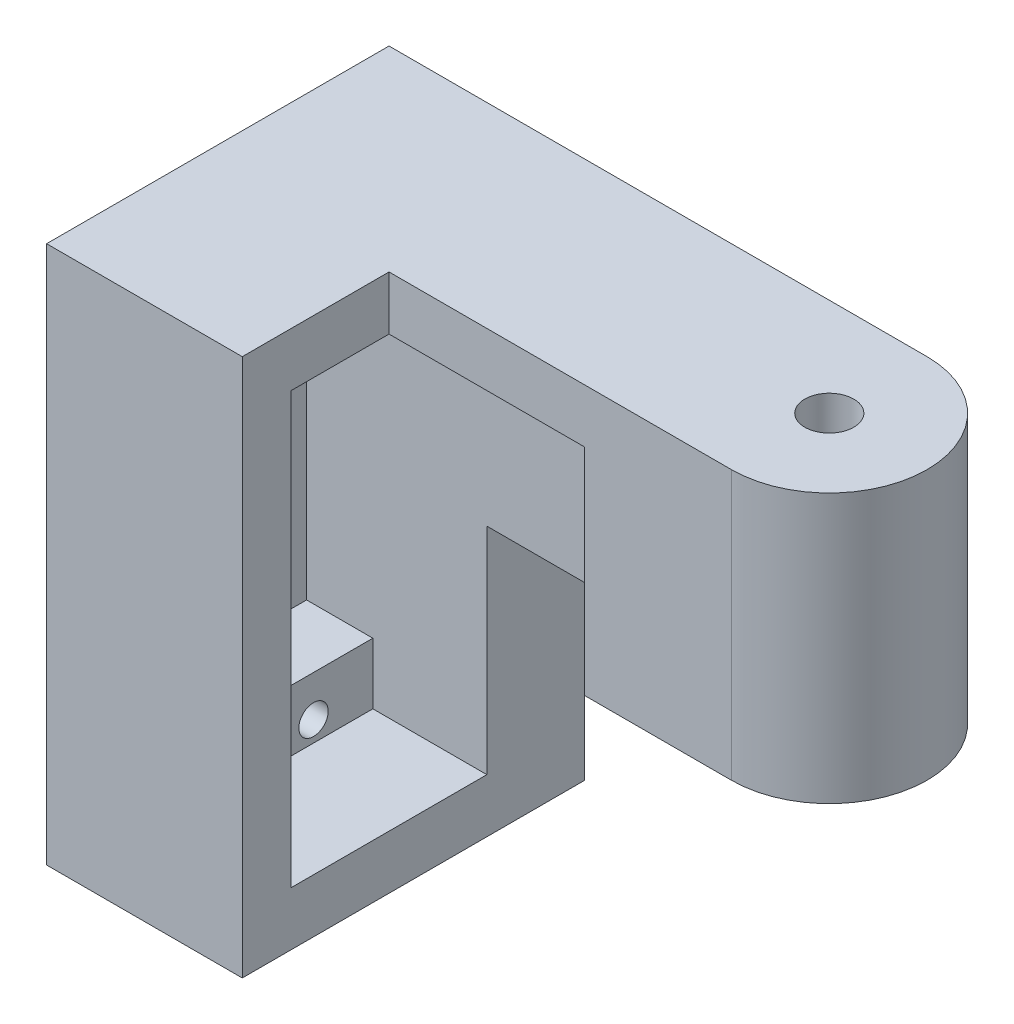
ISO-10303-21;
HEADER;
FILE_DESCRIPTION(('STEP AP214'),'2;1');
FILE_NAME('part.step','',(''),(''),'','','');
FILE_SCHEMA(('AUTOMOTIVE_DESIGN { 1 0 10303 214 1 1 1 1 }'));
ENDSEC;
DATA;
#1=APPLICATION_CONTEXT('core data for automotive mechanical design processes');
#2=APPLICATION_PROTOCOL_DEFINITION('international standard','automotive_design',2000,#1);
#3=PRODUCT_CONTEXT('',#1,'mechanical');
#4=PRODUCT('Part','Part','',(#3));
#5=PRODUCT_RELATED_PRODUCT_CATEGORY('part','',(#4));
#6=PRODUCT_DEFINITION_FORMATION('','',#4);
#7=PRODUCT_DEFINITION_CONTEXT('part definition',#1,'design');
#8=PRODUCT_DEFINITION('design','',#6,#7);
#9=PRODUCT_DEFINITION_SHAPE('','',#8);
#10=(LENGTH_UNIT() NAMED_UNIT(*) SI_UNIT(.MILLI.,.METRE.));
#11=(NAMED_UNIT(*) PLANE_ANGLE_UNIT() SI_UNIT($,.RADIAN.));
#12=(NAMED_UNIT(*) SI_UNIT($,.STERADIAN.) SOLID_ANGLE_UNIT());
#13=UNCERTAINTY_MEASURE_WITH_UNIT(LENGTH_MEASURE(1.E-05),#10,'distance_accuracy_value','');
#14=(GEOMETRIC_REPRESENTATION_CONTEXT(3) GLOBAL_UNCERTAINTY_ASSIGNED_CONTEXT((#13)) GLOBAL_UNIT_ASSIGNED_CONTEXT((#10,
#11,#12)) REPRESENTATION_CONTEXT('',''));
#15=CARTESIAN_POINT('',(0.,0.,0.));
#16=DIRECTION('',(0.,0.,1.));
#17=DIRECTION('',(1.,0.,0.));
#18=AXIS2_PLACEMENT_3D('',#15,#16,#17);
#19=CARTESIAN_POINT('',(0.,38.7349999999999,-75.519629236378));
#20=DIRECTION('',(0.,1.,0.));
#21=DIRECTION('',(0.,0.,1.));
#22=AXIS2_PLACEMENT_3D('',#19,#20,#21);
#23=PLANE('',#22);
#24=DIRECTION('',(1.,0.,0.));
#25=VECTOR('',#24,1.);
#26=CARTESIAN_POINT('',(-102.81210692902,38.7349999999999,12.7));
#27=LINE('',#26,#25);
#28=CARTESIAN_POINT('',(-65.600072,38.7349999999999,12.7));
#29=VERTEX_POINT('',#28);
#30=CARTESIAN_POINT('',(-25.4,38.7349999999999,12.7));
#31=VERTEX_POINT('',#30);
#32=EDGE_CURVE('E356',#29,#31,#27,.T.);
#33=ORIENTED_EDGE('',*,*,#32,.T.);
#34=DIRECTION('',(0.,0.,1.));
#35=VECTOR('',#34,1.);
#36=CARTESIAN_POINT('',(-25.4,38.7349999999999,12.7));
#37=LINE('',#36,#35);
#38=CARTESIAN_POINT('',(-25.4,38.7349999999999,25.4));
#39=VERTEX_POINT('',#38);
#40=EDGE_CURVE('E283',#31,#39,#37,.T.);
#41=ORIENTED_EDGE('',*,*,#40,.T.);
#42=DIRECTION('',(-1.,0.,0.));
#43=VECTOR('',#42,1.);
#44=CARTESIAN_POINT('',(0.,38.7349999999999,25.4));
#45=LINE('',#44,#43);
#46=CARTESIAN_POINT('',(-50.8,38.7349999999999,25.4));
#47=VERTEX_POINT('',#46);
#48=EDGE_CURVE('E262',#39,#47,#45,.T.);
#49=ORIENTED_EDGE('',*,*,#48,.T.);
#50=DIRECTION('',(0.,0.,1.));
#51=VECTOR('',#50,1.);
#52=CARTESIAN_POINT('',(-50.8,38.7349999999999,38.1));
#53=LINE('',#52,#51);
#54=CARTESIAN_POINT('',(-50.8,38.7349999999999,38.1));
#55=VERTEX_POINT('',#54);
#56=EDGE_CURVE('E336',#47,#55,#53,.T.);
#57=ORIENTED_EDGE('',*,*,#56,.T.);
#58=DIRECTION('',(1.,0.,0.));
#59=VECTOR('',#58,1.);
#60=CARTESIAN_POINT('',(-102.81210692902,38.7349999999999,38.1));
#61=LINE('',#60,#59);
#62=CARTESIAN_POINT('',(-65.600072,38.7349999999999,38.1));
#63=VERTEX_POINT('',#62);
#64=EDGE_CURVE('E360',#63,#55,#61,.T.);
#65=ORIENTED_EDGE('',*,*,#64,.F.);
#66=DIRECTION('',(0.,0.,1.));
#67=VECTOR('',#66,1.);
#68=CARTESIAN_POINT('',(-65.600072,38.7349999999999,38.1));
#69=LINE('',#68,#67);
#70=CARTESIAN_POINT('',(-65.600072,38.7349999999999,26.67));
#71=VERTEX_POINT('',#70);
#72=EDGE_CURVE('E363',#71,#63,#69,.T.);
#73=ORIENTED_EDGE('',*,*,#72,.F.);
#74=DIRECTION('',(1.,0.,0.));
#75=VECTOR('',#74,1.);
#76=CARTESIAN_POINT('',(-82.5364202085155,38.7349999999999,26.67));
#77=LINE('',#76,#75);
#78=CARTESIAN_POINT('',(-74.200004,38.7349999999999,26.67));
#79=VERTEX_POINT('',#78);
#80=EDGE_CURVE('E285',#79,#71,#77,.T.);
#81=ORIENTED_EDGE('',*,*,#80,.F.);
#82=DIRECTION('',(0.,0.,1.));
#83=VECTOR('',#82,1.);
#84=CARTESIAN_POINT('',(-74.200004,38.7349999999999,26.67));
#85=LINE('',#84,#83);
#86=CARTESIAN_POINT('',(-74.200004,38.7349999999999,24.13));
#87=VERTEX_POINT('',#86);
#88=EDGE_CURVE('E315',#87,#79,#85,.T.);
#89=ORIENTED_EDGE('',*,*,#88,.F.);
#90=DIRECTION('',(1.,0.,0.));
#91=VECTOR('',#90,1.);
#92=CARTESIAN_POINT('',(-82.5364202085155,38.7349999999999,24.13));
#93=LINE('',#92,#91);
#94=CARTESIAN_POINT('',(-65.600072,38.7349999999999,24.13));
#95=VERTEX_POINT('',#94);
#96=EDGE_CURVE('E323',#87,#95,#93,.T.);
#97=ORIENTED_EDGE('',*,*,#96,.T.);
#98=EDGE_CURVE('E359',#29,#95,#69,.T.);
#99=ORIENTED_EDGE('',*,*,#98,.F.);
#100=EDGE_LOOP('',(#33,#41,#49,#57,#65,#73,#81,#89,#97,#99));
#101=FACE_BOUND('',#100,.T.);
#102=ADVANCED_FACE('F56',(#101),#23,.F.);
#103=CARTESIAN_POINT('',(0.,-17.1450000000001,-75.519629236378));
#104=DIRECTION('',(0.,-1.,0.));
#105=DIRECTION('',(1.,0.,0.));
#106=AXIS2_PLACEMENT_3D('',#103,#104,#105);
#107=PLANE('',#106);
#108=DIRECTION('',(0.,0.,-1.));
#109=VECTOR('',#108,1.);
#110=CARTESIAN_POINT('',(-50.8,-17.1450000000001,38.1));
#111=LINE('',#110,#109);
#112=CARTESIAN_POINT('',(-50.8,-17.1450000000001,38.1));
#113=VERTEX_POINT('',#112);
#114=CARTESIAN_POINT('',(-50.8,-17.1450000000001,12.7));
#115=VERTEX_POINT('',#114);
#116=EDGE_CURVE('E333',#113,#115,#111,.T.);
#117=ORIENTED_EDGE('',*,*,#116,.T.);
#118=DIRECTION('',(1.,0.,0.));
#119=VECTOR('',#118,1.);
#120=CARTESIAN_POINT('',(-102.81210692902,-17.1450000000001,12.7));
#121=LINE('',#120,#119);
#122=CARTESIAN_POINT('',(-65.600072,-17.1450000000001,12.7));
#123=VERTEX_POINT('',#122);
#124=EDGE_CURVE('E342',#123,#115,#121,.T.);
#125=ORIENTED_EDGE('',*,*,#124,.F.);
#126=DIRECTION('',(0.,0.,-1.));
#127=VECTOR('',#126,1.);
#128=CARTESIAN_POINT('',(-65.600072,-17.1450000000001,38.1));
#129=LINE('',#128,#127);
#130=CARTESIAN_POINT('',(-65.600072,-17.1450000000001,24.13));
#131=VERTEX_POINT('',#130);
#132=EDGE_CURVE('E343',#131,#123,#129,.T.);
#133=ORIENTED_EDGE('',*,*,#132,.F.);
#134=DIRECTION('',(1.,0.,0.));
#135=VECTOR('',#134,1.);
#136=CARTESIAN_POINT('',(-82.5364202085155,-17.1450000000001,24.13));
#137=LINE('',#136,#135);
#138=CARTESIAN_POINT('',(-74.200004,-17.1450000000001,24.13));
#139=VERTEX_POINT('',#138);
#140=EDGE_CURVE('E303',#139,#131,#137,.T.);
#141=ORIENTED_EDGE('',*,*,#140,.F.);
#142=DIRECTION('',(0.,0.,-1.));
#143=VECTOR('',#142,1.);
#144=CARTESIAN_POINT('',(-74.200004,-17.1450000000001,26.67));
#145=LINE('',#144,#143);
#146=CARTESIAN_POINT('',(-74.200004,-17.1450000000001,26.67));
#147=VERTEX_POINT('',#146);
#148=EDGE_CURVE('E304',#147,#139,#145,.T.);
#149=ORIENTED_EDGE('',*,*,#148,.F.);
#150=DIRECTION('',(1.,0.,0.));
#151=VECTOR('',#150,1.);
#152=CARTESIAN_POINT('',(-82.5364202085155,-17.1450000000001,26.67));
#153=LINE('',#152,#151);
#154=CARTESIAN_POINT('',(-65.600072,-17.1450000000001,26.67));
#155=VERTEX_POINT('',#154);
#156=EDGE_CURVE('E298',#147,#155,#153,.T.);
#157=ORIENTED_EDGE('',*,*,#156,.T.);
#158=CARTESIAN_POINT('',(-65.600072,-17.1450000000001,38.1));
#159=VERTEX_POINT('',#158);
#160=EDGE_CURVE('E339',#159,#155,#129,.T.);
#161=ORIENTED_EDGE('',*,*,#160,.F.);
#162=DIRECTION('',(1.,0.,0.));
#163=VECTOR('',#162,1.);
#164=CARTESIAN_POINT('',(-102.81210692902,-17.1450000000001,38.1));
#165=LINE('',#164,#163);
#166=EDGE_CURVE('E347',#159,#113,#165,.T.);
#167=ORIENTED_EDGE('',*,*,#166,.T.);
#168=EDGE_LOOP('',(#117,#125,#133,#141,#149,#157,#161,#167));
#169=FACE_BOUND('',#168,.T.);
#170=ADVANCED_FACE('F470',(#169),#107,.F.);
#171=CARTESIAN_POINT('',(-123.583051822423,30.7949599999999,38.1));
#172=DIRECTION('',(0.,1.,0.));
#173=DIRECTION('',(-1.,0.,0.));
#174=AXIS2_PLACEMENT_3D('',#171,#172,#173);
#175=PLANE('',#174);
#176=DIRECTION('',(0.,0.,1.));
#177=VECTOR('',#176,1.);
#178=CARTESIAN_POINT('',(-74.200004,30.7949599999999,38.1));
#179=LINE('',#178,#177);
#180=CARTESIAN_POINT('',(-74.200004,30.7949599999999,26.67));
#181=VERTEX_POINT('',#180);
#182=CARTESIAN_POINT('',(-74.200004,30.7949599999999,38.1));
#183=VERTEX_POINT('',#182);
#184=EDGE_CURVE('E388',#181,#183,#179,.T.);
#185=ORIENTED_EDGE('',*,*,#184,.F.);
#186=DIRECTION('',(1.,0.,0.));
#187=VECTOR('',#186,1.);
#188=CARTESIAN_POINT('',(-82.5364202085155,30.7949599999999,26.67));
#189=LINE('',#188,#187);
#190=CARTESIAN_POINT('',(-65.600072,30.7949599999999,26.67));
#191=VERTEX_POINT('',#190);
#192=EDGE_CURVE('E316',#181,#191,#189,.T.);
#193=ORIENTED_EDGE('',*,*,#192,.T.);
#194=DIRECTION('',(0.,0.,-1.));
#195=VECTOR('',#194,1.);
#196=CARTESIAN_POINT('',(-65.600072,30.7949599999999,38.1));
#197=LINE('',#196,#195);
#198=CARTESIAN_POINT('',(-65.600072,30.7949599999999,38.1));
#199=VERTEX_POINT('',#198);
#200=EDGE_CURVE('E370',#199,#191,#197,.T.);
#201=ORIENTED_EDGE('',*,*,#200,.F.);
#202=DIRECTION('',(1.,0.,0.));
#203=VECTOR('',#202,1.);
#204=CARTESIAN_POINT('',(-123.583051822423,30.7949599999999,38.1));
#205=LINE('',#204,#203);
#206=EDGE_CURVE('E392',#183,#199,#205,.T.);
#207=ORIENTED_EDGE('',*,*,#206,.F.);
#208=EDGE_LOOP('',(#185,#193,#201,#207));
#209=FACE_BOUND('',#208,.T.);
#210=ADVANCED_FACE('F477',(#209),#175,.F.);
#211=CARTESIAN_POINT('',(-123.583051822423,-9.20496000000008,38.1));
#212=DIRECTION('',(0.,-1.,0.));
#213=DIRECTION('',(1.,0.,0.));
#214=AXIS2_PLACEMENT_3D('',#211,#212,#213);
#215=PLANE('',#214);
#216=DIRECTION('',(0.,0.,1.));
#217=VECTOR('',#216,1.);
#218=CARTESIAN_POINT('',(-65.600072,-9.20496000000007,38.1));
#219=LINE('',#218,#217);
#220=CARTESIAN_POINT('',(-65.600072,-9.20496000000008,26.67));
#221=VERTEX_POINT('',#220);
#222=CARTESIAN_POINT('',(-65.600072,-9.20496000000007,38.1));
#223=VERTEX_POINT('',#222);
#224=EDGE_CURVE('E338',#221,#223,#219,.T.);
#225=ORIENTED_EDGE('',*,*,#224,.F.);
#226=DIRECTION('',(1.,0.,0.));
#227=VECTOR('',#226,1.);
#228=CARTESIAN_POINT('',(-82.5364202085155,-9.20496000000008,26.67));
#229=LINE('',#228,#227);
#230=CARTESIAN_POINT('',(-74.200004,-9.20496000000008,26.67));
#231=VERTEX_POINT('',#230);
#232=EDGE_CURVE('E309',#231,#221,#229,.T.);
#233=ORIENTED_EDGE('',*,*,#232,.F.);
#234=DIRECTION('',(0.,0.,-1.));
#235=VECTOR('',#234,1.);
#236=CARTESIAN_POINT('',(-74.200004,-9.20496000000007,38.1));
#237=LINE('',#236,#235);
#238=CARTESIAN_POINT('',(-74.200004,-9.20496000000008,38.1));
#239=VERTEX_POINT('',#238);
#240=EDGE_CURVE('E397',#239,#231,#237,.T.);
#241=ORIENTED_EDGE('',*,*,#240,.F.);
#242=DIRECTION('',(1.,0.,0.));
#243=VECTOR('',#242,1.);
#244=CARTESIAN_POINT('',(-123.583051822423,-9.20496000000008,38.1));
#245=LINE('',#244,#243);
#246=EDGE_CURVE('E404',#239,#223,#245,.T.);
#247=ORIENTED_EDGE('',*,*,#246,.T.);
#248=EDGE_LOOP('',(#225,#233,#241,#247));
#249=FACE_BOUND('',#248,.T.);
#250=ADVANCED_FACE('F547',(#249),#215,.F.);
#251=CARTESIAN_POINT('',(-65.600072,-19.0500000000001,25.4));
#252=DIRECTION('',(-1.,0.,0.));
#253=DIRECTION('',(0.,0.,1.));
#254=AXIS2_PLACEMENT_3D('',#251,#252,#253);
#255=PLANE('',#254);
#256=CARTESIAN_POINT('',(-65.600072,34.499804,30.39999));
#257=DIRECTION('',(-1.,0.,0.));
#258=DIRECTION('',(0.,0.,1.));
#259=AXIS2_PLACEMENT_3D('',#256,#257,#258);
#260=CIRCLE('',#259,1.905);
#261=CARTESIAN_POINT('',(-65.600072,34.499804,32.30499));
#262=VERTEX_POINT('',#261);
#263=EDGE_CURVE('E383',#262,#262,#260,.F.);
#264=ORIENTED_EDGE('',*,*,#263,.F.);
#265=EDGE_LOOP('',(#264));
#266=FACE_BOUND('',#265,.T.);
#267=ORIENTED_EDGE('',*,*,#200,.T.);
#268=DIRECTION('',(0.,-1.,0.));
#269=VECTOR('',#268,1.);
#270=CARTESIAN_POINT('',(-65.600072,38.7349999999999,26.67));
#271=LINE('',#270,#269);
#272=EDGE_CURVE('E295',#71,#191,#271,.T.);
#273=ORIENTED_EDGE('',*,*,#272,.F.);
#274=ORIENTED_EDGE('',*,*,#72,.T.);
#275=DIRECTION('',(0.,-1.,0.));
#276=VECTOR('',#275,1.);
#277=CARTESIAN_POINT('',(-65.600072,38.7349999999999,38.1));
#278=LINE('',#277,#276);
#279=EDGE_CURVE('E313',#63,#199,#278,.T.);
#280=ORIENTED_EDGE('',*,*,#279,.T.);
#281=EDGE_LOOP('',(#267,#273,#274,#280));
#282=FACE_BOUND('',#281,.T.);
#283=ADVANCED_FACE('F463',(#266,#282),#255,.F.);
#284=CARTESIAN_POINT('',(-65.600072,-19.0500000000001,25.4));
#285=DIRECTION('',(-1.,0.,0.));
#286=DIRECTION('',(0.,0.,1.));
#287=AXIS2_PLACEMENT_3D('',#284,#285,#286);
#288=PLANE('',#287);
#289=CARTESIAN_POINT('',(-65.600072,-14.500098,30.39999));
#290=DIRECTION('',(-1.,0.,0.));
#291=DIRECTION('',(0.,0.,1.));
#292=AXIS2_PLACEMENT_3D('',#289,#290,#291);
#293=CIRCLE('',#292,1.90500000000001);
#294=CARTESIAN_POINT('',(-65.600072,-14.500098,32.30499));
#295=VERTEX_POINT('',#294);
#296=EDGE_CURVE('E377',#295,#295,#293,.F.);
#297=ORIENTED_EDGE('',*,*,#296,.F.);
#298=EDGE_LOOP('',(#297));
#299=FACE_BOUND('',#298,.T.);
#300=ORIENTED_EDGE('',*,*,#160,.T.);
#301=DIRECTION('',(0.,-1.,0.));
#302=VECTOR('',#301,1.);
#303=CARTESIAN_POINT('',(-65.600072,-17.1450000000001,26.67));
#304=LINE('',#303,#302);
#305=EDGE_CURVE('E292',#221,#155,#304,.T.);
#306=ORIENTED_EDGE('',*,*,#305,.F.);
#307=ORIENTED_EDGE('',*,*,#224,.T.);
#308=DIRECTION('',(0.,-1.,0.));
#309=VECTOR('',#308,1.);
#310=CARTESIAN_POINT('',(-65.600072,-17.1450000000001,38.1));
#311=LINE('',#310,#309);
#312=EDGE_CURVE('E344',#223,#159,#311,.T.);
#313=ORIENTED_EDGE('',*,*,#312,.T.);
#314=EDGE_LOOP('',(#300,#306,#307,#313));
#315=FACE_BOUND('',#314,.T.);
#316=ADVANCED_FACE('F454',(#299,#315),#288,.F.);
#317=CARTESIAN_POINT('',(-76.2,-19.0500000000001,25.4));
#318=DIRECTION('',(-1.,0.,0.));
#319=DIRECTION('',(0.,0.,1.));
#320=AXIS2_PLACEMENT_3D('',#317,#318,#319);
#321=PLANE('',#320);
#322=CARTESIAN_POINT('',(-76.2,-14.500098,20.40001));
#323=DIRECTION('',(-1.,0.,0.));
#324=DIRECTION('',(0.,0.,-1.));
#325=AXIS2_PLACEMENT_3D('',#322,#323,#324);
#326=CIRCLE('',#325,1.90500000000001);
#327=CARTESIAN_POINT('',(-76.2,-14.500098,18.49501));
#328=VERTEX_POINT('',#327);
#329=EDGE_CURVE('E416',#328,#328,#326,.T.);
#330=ORIENTED_EDGE('',*,*,#329,.F.);
#331=EDGE_LOOP('',(#330));
#332=FACE_BOUND('',#331,.T.);
#333=CARTESIAN_POINT('',(-76.2,34.499804,20.40001));
#334=DIRECTION('',(-1.,0.,0.));
#335=DIRECTION('',(0.,0.,-1.));
#336=AXIS2_PLACEMENT_3D('',#333,#334,#335);
#337=CIRCLE('',#336,1.90500000000001);
#338=CARTESIAN_POINT('',(-76.2,34.499804,18.49501));
#339=VERTEX_POINT('',#338);
#340=EDGE_CURVE('E424',#339,#339,#337,.T.);
#341=ORIENTED_EDGE('',*,*,#340,.F.);
#342=EDGE_LOOP('',(#341));
#343=FACE_BOUND('',#342,.T.);
#344=CARTESIAN_POINT('',(-76.2,34.499804,30.39999));
#345=DIRECTION('',(-1.,0.,0.));
#346=DIRECTION('',(0.,0.,1.));
#347=AXIS2_PLACEMENT_3D('',#344,#345,#346);
#348=CIRCLE('',#347,1.905);
#349=CARTESIAN_POINT('',(-76.2,34.499804,32.30499));
#350=VERTEX_POINT('',#349);
#351=EDGE_CURVE('E421',#350,#350,#348,.T.);
#352=ORIENTED_EDGE('',*,*,#351,.F.);
#353=EDGE_LOOP('',(#352));
#354=FACE_BOUND('',#353,.T.);
#355=CARTESIAN_POINT('',(-76.2,-14.500098,30.39999));
#356=DIRECTION('',(-1.,0.,0.));
#357=DIRECTION('',(0.,0.,1.));
#358=AXIS2_PLACEMENT_3D('',#355,#356,#357);
#359=CIRCLE('',#358,1.90500000000001);
#360=CARTESIAN_POINT('',(-76.2,-14.500098,32.30499));
#361=VERTEX_POINT('',#360);
#362=EDGE_CURVE('E417',#361,#361,#359,.T.);
#363=ORIENTED_EDGE('',*,*,#362,.F.);
#364=EDGE_LOOP('',(#363));
#365=FACE_BOUND('',#364,.T.);
#366=CARTESIAN_POINT('',(-76.2,0.,25.4));
#367=DIRECTION('',(-1.,0.,0.));
#368=DIRECTION('',(0.,0.,1.));
#369=AXIS2_PLACEMENT_3D('',#366,#367,#368);
#370=CIRCLE('',#369,6.98499999999999);
#371=CARTESIAN_POINT('',(-76.2,0.,32.385));
#372=VERTEX_POINT('',#371);
#373=EDGE_CURVE('E420',#372,#372,#370,.T.);
#374=ORIENTED_EDGE('',*,*,#373,.F.);
#375=EDGE_LOOP('',(#374));
#376=FACE_BOUND('',#375,.T.);
#377=DIRECTION('',(0.,0.,1.));
#378=VECTOR('',#377,1.);
#379=CARTESIAN_POINT('',(-76.2,45.7199999999999,-74.3248444330696));
#380=LINE('',#379,#378);
#381=CARTESIAN_POINT('',(-76.2,45.7199999999999,0.));
#382=VERTEX_POINT('',#381);
#383=CARTESIAN_POINT('',(-76.2,45.7199999999999,44.45));
#384=VERTEX_POINT('',#383);
#385=EDGE_CURVE('E254',#382,#384,#380,.T.);
#386=ORIENTED_EDGE('',*,*,#385,.F.);
#387=DIRECTION('',(0.,1.,0.));
#388=VECTOR('',#387,1.);
#389=CARTESIAN_POINT('',(-76.2,-19.0500000000001,0.));
#390=LINE('',#389,#388);
#391=CARTESIAN_POINT('',(-76.2,-24.1300000000001,0.));
#392=VERTEX_POINT('',#391);
#393=EDGE_CURVE('E248',#392,#382,#390,.T.);
#394=ORIENTED_EDGE('',*,*,#393,.F.);
#395=DIRECTION('',(0.,0.,1.));
#396=VECTOR('',#395,1.);
#397=CARTESIAN_POINT('',(-76.2,-24.1300000000001,-74.3248444330696));
#398=LINE('',#397,#396);
#399=CARTESIAN_POINT('',(-76.2,-24.1300000000001,44.45));
#400=VERTEX_POINT('',#399);
#401=EDGE_CURVE('E237',#392,#400,#398,.T.);
#402=ORIENTED_EDGE('',*,*,#401,.T.);
#403=DIRECTION('',(0.,-1.,0.));
#404=VECTOR('',#403,1.);
#405=CARTESIAN_POINT('',(-76.2,45.7199999999999,44.45));
#406=LINE('',#405,#404);
#407=EDGE_CURVE('E431',#384,#400,#406,.T.);
#408=ORIENTED_EDGE('',*,*,#407,.F.);
#409=EDGE_LOOP('',(#386,#394,#402,#408));
#410=FACE_BOUND('',#409,.T.);
#411=ADVANCED_FACE('F58',(#332,#343,#354,#365,#376,#410),#321,.T.);
#412=CARTESIAN_POINT('',(0.,0.,0.));
#413=DIRECTION('',(0.,0.,1.));
#414=DIRECTION('',(1.,0.,0.));
#415=AXIS2_PLACEMENT_3D('',#412,#413,#414);
#416=PLANE('',#415);
#417=DIRECTION('',(-1.,0.,0.));
#418=VECTOR('',#417,1.);
#419=CARTESIAN_POINT('',(-50.8,10.7949999999999,0.));
#420=LINE('',#419,#418);
#421=CARTESIAN_POINT('',(-6.35000000000001,10.7949999999999,0.));
#422=VERTEX_POINT('',#421);
#423=CARTESIAN_POINT('',(-50.8,10.7949999999999,0.));
#424=VERTEX_POINT('',#423);
#425=EDGE_CURVE('E71',#422,#424,#420,.T.);
#426=ORIENTED_EDGE('',*,*,#425,.T.);
#427=DIRECTION('',(0.,-1.,0.));
#428=VECTOR('',#427,1.);
#429=CARTESIAN_POINT('',(-50.8,-24.1300000000001,0.));
#430=LINE('',#429,#428);
#431=CARTESIAN_POINT('',(-50.8,-24.1300000000001,0.));
#432=VERTEX_POINT('',#431);
#433=EDGE_CURVE('E229',#424,#432,#430,.T.);
#434=ORIENTED_EDGE('',*,*,#433,.T.);
#435=DIRECTION('',(-1.,0.,0.));
#436=VECTOR('',#435,1.);
#437=CARTESIAN_POINT('',(-76.2,-24.1300000000001,0.));
#438=LINE('',#437,#436);
#439=EDGE_CURVE('E241',#432,#392,#438,.T.);
#440=ORIENTED_EDGE('',*,*,#439,.T.);
#441=ORIENTED_EDGE('',*,*,#393,.T.);
#442=DIRECTION('',(1.,0.,0.));
#443=VECTOR('',#442,1.);
#444=CARTESIAN_POINT('',(-76.2,45.7199999999999,0.));
#445=LINE('',#444,#443);
#446=CARTESIAN_POINT('',(-6.35000000000001,45.7199999999999,0.));
#447=VERTEX_POINT('',#446);
#448=EDGE_CURVE('E249',#382,#447,#445,.T.);
#449=ORIENTED_EDGE('',*,*,#448,.T.);
#450=DIRECTION('',(0.,1.,0.));
#451=VECTOR('',#450,1.);
#452=CARTESIAN_POINT('',(-6.35000000000001,-24.1300000000001,0.));
#453=LINE('',#452,#451);
#454=EDGE_CURVE('E268',#422,#447,#453,.T.);
#455=ORIENTED_EDGE('',*,*,#454,.F.);
#456=EDGE_LOOP('',(#426,#434,#440,#441,#449,#455));
#457=FACE_BOUND('',#456,.T.);
#458=ADVANCED_FACE('F240',(#457),#416,.F.);
#459=CARTESIAN_POINT('',(0.,0.,25.4));
#460=DIRECTION('',(0.,0.,1.));
#461=DIRECTION('',(1.,0.,0.));
#462=AXIS2_PLACEMENT_3D('',#459,#460,#461);
#463=PLANE('',#462);
#464=DIRECTION('',(-1.,0.,0.));
#465=VECTOR('',#464,1.);
#466=CARTESIAN_POINT('',(-50.8,10.7949999999999,25.4));
#467=LINE('',#466,#465);
#468=CARTESIAN_POINT('',(-6.35000000000002,10.7949999999999,25.4));
#469=VERTEX_POINT('',#468);
#470=CARTESIAN_POINT('',(-25.4,10.7949999999999,25.4));
#471=VERTEX_POINT('',#470);
#472=EDGE_CURVE('E244',#469,#471,#467,.T.);
#473=ORIENTED_EDGE('',*,*,#472,.F.);
#474=DIRECTION('',(0.,1.,0.));
#475=VECTOR('',#474,1.);
#476=CARTESIAN_POINT('',(-6.35000000000001,-24.1300000000001,25.4));
#477=LINE('',#476,#475);
#478=CARTESIAN_POINT('',(-6.35000000000001,45.7199999999999,25.4));
#479=VERTEX_POINT('',#478);
#480=EDGE_CURVE('E270',#469,#479,#477,.T.);
#481=ORIENTED_EDGE('',*,*,#480,.T.);
#482=DIRECTION('',(-1.,0.,0.));
#483=VECTOR('',#482,1.);
#484=CARTESIAN_POINT('',(-50.8,45.7199999999999,25.4));
#485=LINE('',#484,#483);
#486=CARTESIAN_POINT('',(-50.8,45.7199999999999,25.4));
#487=VERTEX_POINT('',#486);
#488=EDGE_CURVE('E414',#479,#487,#485,.T.);
#489=ORIENTED_EDGE('',*,*,#488,.T.);
#490=DIRECTION('',(0.,1.,0.));
#491=VECTOR('',#490,1.);
#492=CARTESIAN_POINT('',(-50.8,0.,25.4));
#493=LINE('',#492,#491);
#494=EDGE_CURVE('E251',#47,#487,#493,.T.);
#495=ORIENTED_EDGE('',*,*,#494,.F.);
#496=ORIENTED_EDGE('',*,*,#48,.F.);
#497=DIRECTION('',(0.,-1.,0.));
#498=VECTOR('',#497,1.);
#499=CARTESIAN_POINT('',(-25.4,95.5311266284946,25.4));
#500=LINE('',#499,#498);
#501=EDGE_CURVE('E276',#39,#471,#500,.T.);
#502=ORIENTED_EDGE('',*,*,#501,.T.);
#503=EDGE_LOOP('',(#473,#481,#489,#495,#496,#502));
#504=FACE_BOUND('',#503,.T.);
#505=ADVANCED_FACE('F461',(#504),#463,.T.);
#506=CARTESIAN_POINT('',(-76.2,45.7199999999999,-74.3248444330696));
#507=DIRECTION('',(0.,1.,0.));
#508=DIRECTION('',(0.,0.,1.));
#509=AXIS2_PLACEMENT_3D('',#506,#507,#508);
#510=PLANE('',#509);
#511=CARTESIAN_POINT('',(-6.35000000000001,45.7199999999999,12.7));
#512=DIRECTION('',(0.,-1.,0.));
#513=DIRECTION('',(0.,0.,-1.));
#514=AXIS2_PLACEMENT_3D('',#511,#512,#513);
#515=CIRCLE('',#514,3.175);
#516=CARTESIAN_POINT('',(-6.35000000000001,45.7199999999999,9.52500000000001));
#517=VERTEX_POINT('',#516);
#518=EDGE_CURVE('E517',#517,#517,#515,.T.);
#519=ORIENTED_EDGE('',*,*,#518,.T.);
#520=EDGE_LOOP('',(#519));
#521=FACE_BOUND('',#520,.T.);
#522=CARTESIAN_POINT('',(-6.35000000000001,45.7199999999999,12.7));
#523=DIRECTION('',(0.,-1.,0.));
#524=DIRECTION('',(0.,0.,1.));
#525=AXIS2_PLACEMENT_3D('',#522,#523,#524);
#526=CIRCLE('',#525,12.7);
#527=EDGE_CURVE('E278',#447,#479,#526,.T.);
#528=ORIENTED_EDGE('',*,*,#527,.F.);
#529=ORIENTED_EDGE('',*,*,#448,.F.);
#530=ORIENTED_EDGE('',*,*,#385,.T.);
#531=DIRECTION('',(-1.,0.,0.));
#532=VECTOR('',#531,1.);
#533=CARTESIAN_POINT('',(-76.2,45.7199999999999,44.45));
#534=LINE('',#533,#532);
#535=CARTESIAN_POINT('',(-50.8,45.7199999999999,44.45));
#536=VERTEX_POINT('',#535);
#537=EDGE_CURVE('E437',#536,#384,#534,.T.);
#538=ORIENTED_EDGE('',*,*,#537,.F.);
#539=DIRECTION('',(0.,0.,1.));
#540=VECTOR('',#539,1.);
#541=CARTESIAN_POINT('',(-50.8,45.7199999999999,-74.3248444330696));
#542=LINE('',#541,#540);
#543=EDGE_CURVE('E236',#487,#536,#542,.T.);
#544=ORIENTED_EDGE('',*,*,#543,.F.);
#545=ORIENTED_EDGE('',*,*,#488,.F.);
#546=EDGE_LOOP('',(#528,#529,#530,#538,#544,#545));
#547=FACE_BOUND('',#546,.T.);
#548=ADVANCED_FACE('F450',(#521,#547),#510,.T.);
#549=CARTESIAN_POINT('',(-50.8,45.7199999999999,-74.3248444330696));
#550=DIRECTION('',(1.,0.,0.));
#551=DIRECTION('',(0.,1.,0.));
#552=AXIS2_PLACEMENT_3D('',#549,#550,#551);
#553=PLANE('',#552);
#554=ORIENTED_EDGE('',*,*,#116,.F.);
#555=DIRECTION('',(0.,-1.,0.));
#556=VECTOR('',#555,1.);
#557=CARTESIAN_POINT('',(-50.8,-9.20496000000007,38.1));
#558=LINE('',#557,#556);
#559=EDGE_CURVE('E386',#55,#113,#558,.T.);
#560=ORIENTED_EDGE('',*,*,#559,.F.);
#561=ORIENTED_EDGE('',*,*,#56,.F.);
#562=ORIENTED_EDGE('',*,*,#494,.T.);
#563=ORIENTED_EDGE('',*,*,#543,.T.);
#564=DIRECTION('',(0.,1.,0.));
#565=VECTOR('',#564,1.);
#566=CARTESIAN_POINT('',(-50.8,45.7199999999999,44.45));
#567=LINE('',#566,#565);
#568=CARTESIAN_POINT('',(-50.8,-24.1300000000001,44.45));
#569=VERTEX_POINT('',#568);
#570=EDGE_CURVE('E231',#569,#536,#567,.T.);
#571=ORIENTED_EDGE('',*,*,#570,.F.);
#572=DIRECTION('',(0.,0.,1.));
#573=VECTOR('',#572,1.);
#574=CARTESIAN_POINT('',(-50.8,-24.1300000000001,-74.3248444330696));
#575=LINE('',#574,#573);
#576=EDGE_CURVE('E224',#432,#569,#575,.T.);
#577=ORIENTED_EDGE('',*,*,#576,.F.);
#578=ORIENTED_EDGE('',*,*,#433,.F.);
#579=DIRECTION('',(0.,0.,1.));
#580=VECTOR('',#579,1.);
#581=CARTESIAN_POINT('',(-50.8,10.7949999999999,0.));
#582=LINE('',#581,#580);
#583=CARTESIAN_POINT('',(-50.8,10.7949999999999,12.7));
#584=VERTEX_POINT('',#583);
#585=EDGE_CURVE('E524',#424,#584,#582,.T.);
#586=ORIENTED_EDGE('',*,*,#585,.T.);
#587=DIRECTION('',(0.,1.,0.));
#588=VECTOR('',#587,1.);
#589=CARTESIAN_POINT('',(-50.8,-9.20496000000008,12.7));
#590=LINE('',#589,#588);
#591=EDGE_CURVE('E13',#115,#584,#590,.T.);
#592=ORIENTED_EDGE('',*,*,#591,.F.);
#593=EDGE_LOOP('',(#554,#560,#561,#562,#563,#571,#577,#578,#586,#592));
#594=FACE_BOUND('',#593,.T.);
#595=ADVANCED_FACE('F227',(#594),#553,.T.);
#596=CARTESIAN_POINT('',(-76.2,-24.1300000000001,-74.3248444330696));
#597=DIRECTION('',(0.,-1.,0.));
#598=DIRECTION('',(0.,0.,-1.));
#599=AXIS2_PLACEMENT_3D('',#596,#597,#598);
#600=PLANE('',#599);
#601=ORIENTED_EDGE('',*,*,#439,.F.);
#602=ORIENTED_EDGE('',*,*,#576,.T.);
#603=DIRECTION('',(1.,0.,0.));
#604=VECTOR('',#603,1.);
#605=CARTESIAN_POINT('',(-76.2,-24.1300000000001,44.45));
#606=LINE('',#605,#604);
#607=EDGE_CURVE('E434',#400,#569,#606,.T.);
#608=ORIENTED_EDGE('',*,*,#607,.F.);
#609=ORIENTED_EDGE('',*,*,#401,.F.);
#610=EDGE_LOOP('',(#601,#602,#608,#609));
#611=FACE_BOUND('',#610,.T.);
#612=ADVANCED_FACE('F247',(#611),#600,.T.);
#613=CARTESIAN_POINT('',(0.,0.,44.45));
#614=DIRECTION('',(0.,0.,1.));
#615=DIRECTION('',(1.,0.,0.));
#616=AXIS2_PLACEMENT_3D('',#613,#614,#615);
#617=PLANE('',#616);
#618=ORIENTED_EDGE('',*,*,#407,.T.);
#619=ORIENTED_EDGE('',*,*,#607,.T.);
#620=ORIENTED_EDGE('',*,*,#570,.T.);
#621=ORIENTED_EDGE('',*,*,#537,.T.);
#622=EDGE_LOOP('',(#618,#619,#620,#621));
#623=FACE_BOUND('',#622,.T.);
#624=ADVANCED_FACE('F448',(#623),#617,.T.);
#625=CARTESIAN_POINT('',(-31.0434365336479,0.,25.4));
#626=DIRECTION('',(-1.,0.,0.));
#627=DIRECTION('',(0.,0.,1.));
#628=AXIS2_PLACEMENT_3D('',#625,#626,#627);
#629=CYLINDRICAL_SURFACE('',#628,6.98499999999999);
#630=CARTESIAN_POINT('',(-74.200004,0.,25.4));
#631=DIRECTION('',(-1.,0.,0.));
#632=DIRECTION('',(0.,0.,1.));
#633=AXIS2_PLACEMENT_3D('',#630,#631,#632);
#634=CIRCLE('',#633,6.98499999999999);
#635=CARTESIAN_POINT('',(-74.200004,0.,32.385));
#636=VERTEX_POINT('',#635);
#637=EDGE_CURVE('E260',#636,#636,#634,.F.);
#638=ORIENTED_EDGE('',*,*,#637,.T.);
#639=EDGE_LOOP('',(#638));
#640=FACE_BOUND('',#639,.T.);
#641=ORIENTED_EDGE('',*,*,#373,.T.);
#642=EDGE_LOOP('',(#641));
#643=FACE_BOUND('',#642,.T.);
#644=ADVANCED_FACE('F488',(#640,#643),#629,.F.);
#645=CARTESIAN_POINT('',(-31.0434365336479,-14.500098,30.39999));
#646=DIRECTION('',(-1.,0.,0.));
#647=DIRECTION('',(0.,0.,1.));
#648=AXIS2_PLACEMENT_3D('',#645,#646,#647);
#649=CYLINDRICAL_SURFACE('',#648,1.90500000000001);
#650=ORIENTED_EDGE('',*,*,#296,.T.);
#651=EDGE_LOOP('',(#650));
#652=FACE_BOUND('',#651,.T.);
#653=ORIENTED_EDGE('',*,*,#362,.T.);
#654=EDGE_LOOP('',(#653));
#655=FACE_BOUND('',#654,.T.);
#656=ADVANCED_FACE('F484',(#652,#655),#649,.F.);
#657=CARTESIAN_POINT('',(-31.0434365336479,34.499804,30.39999));
#658=DIRECTION('',(-1.,0.,0.));
#659=DIRECTION('',(0.,0.,1.));
#660=AXIS2_PLACEMENT_3D('',#657,#658,#659);
#661=CYLINDRICAL_SURFACE('',#660,1.905);
#662=ORIENTED_EDGE('',*,*,#263,.T.);
#663=EDGE_LOOP('',(#662));
#664=FACE_BOUND('',#663,.T.);
#665=ORIENTED_EDGE('',*,*,#351,.T.);
#666=EDGE_LOOP('',(#665));
#667=FACE_BOUND('',#666,.T.);
#668=ADVANCED_FACE('F487',(#664,#667),#661,.F.);
#669=CARTESIAN_POINT('',(-31.0434365336479,34.499804,20.40001));
#670=DIRECTION('',(-1.,0.,0.));
#671=DIRECTION('',(0.,0.,1.));
#672=AXIS2_PLACEMENT_3D('',#669,#670,#671);
#673=CYLINDRICAL_SURFACE('',#672,1.90500000000001);
#674=CARTESIAN_POINT('',(-65.600072,34.499804,20.40001));
#675=DIRECTION('',(-1.,0.,0.));
#676=DIRECTION('',(0.,0.,1.));
#677=AXIS2_PLACEMENT_3D('',#674,#675,#676);
#678=CIRCLE('',#677,1.90500000000001);
#679=CARTESIAN_POINT('',(-65.600072,34.499804,22.30501));
#680=VERTEX_POINT('',#679);
#681=EDGE_CURVE('E380',#680,#680,#678,.F.);
#682=ORIENTED_EDGE('',*,*,#681,.T.);
#683=EDGE_LOOP('',(#682));
#684=FACE_BOUND('',#683,.T.);
#685=ORIENTED_EDGE('',*,*,#340,.T.);
#686=EDGE_LOOP('',(#685));
#687=FACE_BOUND('',#686,.T.);
#688=ADVANCED_FACE('F492',(#684,#687),#673,.F.);
#689=CARTESIAN_POINT('',(-31.0434365336479,-14.500098,20.40001));
#690=DIRECTION('',(-1.,0.,0.));
#691=DIRECTION('',(0.,0.,1.));
#692=AXIS2_PLACEMENT_3D('',#689,#690,#691);
#693=CYLINDRICAL_SURFACE('',#692,1.90500000000001);
#694=CARTESIAN_POINT('',(-65.600072,-14.500098,20.40001));
#695=DIRECTION('',(-1.,0.,0.));
#696=DIRECTION('',(0.,0.,1.));
#697=AXIS2_PLACEMENT_3D('',#694,#695,#696);
#698=CIRCLE('',#697,1.90500000000001);
#699=CARTESIAN_POINT('',(-65.600072,-14.500098,22.30501));
#700=VERTEX_POINT('',#699);
#701=EDGE_CURVE('E355',#700,#700,#698,.F.);
#702=ORIENTED_EDGE('',*,*,#701,.T.);
#703=EDGE_LOOP('',(#702));
#704=FACE_BOUND('',#703,.T.);
#705=ORIENTED_EDGE('',*,*,#329,.T.);
#706=EDGE_LOOP('',(#705));
#707=FACE_BOUND('',#706,.T.);
#708=ADVANCED_FACE('F496',(#704,#707),#693,.F.);
#709=CARTESIAN_POINT('',(-74.200004,-19.0500000000001,25.4));
#710=DIRECTION('',(-1.,0.,0.));
#711=DIRECTION('',(0.,0.,1.));
#712=AXIS2_PLACEMENT_3D('',#709,#710,#711);
#713=PLANE('',#712);
#714=DIRECTION('',(0.,1.,0.));
#715=VECTOR('',#714,1.);
#716=CARTESIAN_POINT('',(-74.200004,-9.20496000000008,12.7));
#717=LINE('',#716,#715);
#718=CARTESIAN_POINT('',(-74.200004,-9.20496000000007,12.7));
#719=VERTEX_POINT('',#718);
#720=CARTESIAN_POINT('',(-74.200004,30.7949599999999,12.7));
#721=VERTEX_POINT('',#720);
#722=EDGE_CURVE('E393',#719,#721,#717,.T.);
#723=ORIENTED_EDGE('',*,*,#722,.T.);
#724=CARTESIAN_POINT('',(-74.200004,30.7949599999999,24.13));
#725=VERTEX_POINT('',#724);
#726=EDGE_CURVE('E389',#721,#725,#179,.T.);
#727=ORIENTED_EDGE('',*,*,#726,.T.);
#728=DIRECTION('',(0.,1.,0.));
#729=VECTOR('',#728,1.);
#730=CARTESIAN_POINT('',(-74.200004,38.7349999999999,24.13));
#731=LINE('',#730,#729);
#732=EDGE_CURVE('E322',#725,#87,#731,.T.);
#733=ORIENTED_EDGE('',*,*,#732,.T.);
#734=ORIENTED_EDGE('',*,*,#88,.T.);
#735=DIRECTION('',(0.,-1.,0.));
#736=VECTOR('',#735,1.);
#737=CARTESIAN_POINT('',(-74.200004,38.7349999999999,26.67));
#738=LINE('',#737,#736);
#739=EDGE_CURVE('E319',#79,#181,#738,.T.);
#740=ORIENTED_EDGE('',*,*,#739,.T.);
#741=ORIENTED_EDGE('',*,*,#184,.T.);
#742=DIRECTION('',(0.,-1.,0.));
#743=VECTOR('',#742,1.);
#744=CARTESIAN_POINT('',(-74.200004,-9.20496000000008,38.1));
#745=LINE('',#744,#743);
#746=EDGE_CURVE('E401',#183,#239,#745,.T.);
#747=ORIENTED_EDGE('',*,*,#746,.T.);
#748=ORIENTED_EDGE('',*,*,#240,.T.);
#749=DIRECTION('',(0.,-1.,0.));
#750=VECTOR('',#749,1.);
#751=CARTESIAN_POINT('',(-74.200004,-17.1450000000001,26.67));
#752=LINE('',#751,#750);
#753=EDGE_CURVE('E291',#231,#147,#752,.T.);
#754=ORIENTED_EDGE('',*,*,#753,.T.);
#755=ORIENTED_EDGE('',*,*,#148,.T.);
#756=DIRECTION('',(0.,1.,0.));
#757=VECTOR('',#756,1.);
#758=CARTESIAN_POINT('',(-74.200004,-17.1450000000001,24.13));
#759=LINE('',#758,#757);
#760=CARTESIAN_POINT('',(-74.200004,-9.20496000000008,24.13));
#761=VERTEX_POINT('',#760);
#762=EDGE_CURVE('E299',#139,#761,#759,.T.);
#763=ORIENTED_EDGE('',*,*,#762,.T.);
#764=EDGE_CURVE('E400',#761,#719,#237,.T.);
#765=ORIENTED_EDGE('',*,*,#764,.T.);
#766=EDGE_LOOP('',(#723,#727,#733,#734,#740,#741,#747,#748,#754,#755,#763,#765));
#767=FACE_BOUND('',#766,.T.);
#768=ORIENTED_EDGE('',*,*,#637,.F.);
#769=EDGE_LOOP('',(#768));
#770=FACE_BOUND('',#769,.T.);
#771=ADVANCED_FACE('F481',(#767,#770),#713,.F.);
#772=CARTESIAN_POINT('',(-65.600072,30.7949599999999,24.13));
#773=VERTEX_POINT('',#772);
#774=CARTESIAN_POINT('',(-65.600072,30.7949599999999,12.7));
#775=VERTEX_POINT('',#774);
#776=EDGE_CURVE('E366',#773,#775,#197,.T.);
#777=ORIENTED_EDGE('',*,*,#776,.F.);
#778=DIRECTION('',(1.,0.,0.));
#779=VECTOR('',#778,1.);
#780=CARTESIAN_POINT('',(-82.5364202085155,30.7949599999999,24.13));
#781=LINE('',#780,#779);
#782=EDGE_CURVE('E320',#725,#773,#781,.T.);
#783=ORIENTED_EDGE('',*,*,#782,.F.);
#784=ORIENTED_EDGE('',*,*,#726,.F.);
#785=DIRECTION('',(1.,0.,0.));
#786=VECTOR('',#785,1.);
#787=CARTESIAN_POINT('',(-123.583051822423,30.7949599999999,12.7));
#788=LINE('',#787,#786);
#789=EDGE_CURVE('E263',#721,#775,#788,.T.);
#790=ORIENTED_EDGE('',*,*,#789,.T.);
#791=EDGE_LOOP('',(#777,#783,#784,#790));
#792=FACE_BOUND('',#791,.T.);
#793=ADVANCED_FACE('F565',(#792),#175,.F.);
#794=CARTESIAN_POINT('',(-123.583051822423,-9.20496000000008,38.1));
#795=DIRECTION('',(0.,0.,1.));
#796=DIRECTION('',(1.,0.,0.));
#797=AXIS2_PLACEMENT_3D('',#794,#795,#796);
#798=PLANE('',#797);
#799=ORIENTED_EDGE('',*,*,#206,.T.);
#800=ORIENTED_EDGE('',*,*,#279,.F.);
#801=ORIENTED_EDGE('',*,*,#64,.T.);
#802=ORIENTED_EDGE('',*,*,#559,.T.);
#803=ORIENTED_EDGE('',*,*,#166,.F.);
#804=ORIENTED_EDGE('',*,*,#312,.F.);
#805=ORIENTED_EDGE('',*,*,#246,.F.);
#806=ORIENTED_EDGE('',*,*,#746,.F.);
#807=EDGE_LOOP('',(#799,#800,#801,#802,#803,#804,#805,#806));
#808=FACE_BOUND('',#807,.T.);
#809=ADVANCED_FACE('F536',(#808),#798,.F.);
#810=ORIENTED_EDGE('',*,*,#764,.F.);
#811=DIRECTION('',(1.,0.,0.));
#812=VECTOR('',#811,1.);
#813=CARTESIAN_POINT('',(-82.5364202085155,-9.20496000000008,24.13));
#814=LINE('',#813,#812);
#815=CARTESIAN_POINT('',(-65.600072,-9.20496000000008,24.13));
#816=VERTEX_POINT('',#815);
#817=EDGE_CURVE('E302',#761,#816,#814,.T.);
#818=ORIENTED_EDGE('',*,*,#817,.T.);
#819=CARTESIAN_POINT('',(-65.600072,-9.20496000000007,12.7));
#820=VERTEX_POINT('',#819);
#821=EDGE_CURVE('E348',#820,#816,#219,.T.);
#822=ORIENTED_EDGE('',*,*,#821,.F.);
#823=DIRECTION('',(1.,0.,0.));
#824=VECTOR('',#823,1.);
#825=CARTESIAN_POINT('',(-123.583051822423,-9.20496000000008,12.7));
#826=LINE('',#825,#824);
#827=EDGE_CURVE('E396',#719,#820,#826,.T.);
#828=ORIENTED_EDGE('',*,*,#827,.F.);
#829=EDGE_LOOP('',(#810,#818,#822,#828));
#830=FACE_BOUND('',#829,.T.);
#831=ADVANCED_FACE('F586',(#830),#215,.F.);
#832=CARTESIAN_POINT('',(-123.583051822423,-9.20496000000008,12.7));
#833=DIRECTION('',(0.,0.,-1.));
#834=DIRECTION('',(-1.,0.,0.));
#835=AXIS2_PLACEMENT_3D('',#832,#833,#834);
#836=PLANE('',#835);
#837=ORIENTED_EDGE('',*,*,#124,.T.);
#838=ORIENTED_EDGE('',*,*,#591,.T.);
#839=DIRECTION('',(1.,0.,0.));
#840=VECTOR('',#839,1.);
#841=CARTESIAN_POINT('',(-123.583051822423,10.7949999999999,12.7));
#842=LINE('',#841,#840);
#843=CARTESIAN_POINT('',(-25.4,10.7949999999999,12.7));
#844=VERTEX_POINT('',#843);
#845=EDGE_CURVE('E527',#584,#844,#842,.T.);
#846=ORIENTED_EDGE('',*,*,#845,.T.);
#847=DIRECTION('',(0.,-1.,0.));
#848=VECTOR('',#847,1.);
#849=CARTESIAN_POINT('',(-25.4,95.5311266284946,12.7));
#850=LINE('',#849,#848);
#851=EDGE_CURVE('E273',#31,#844,#850,.T.);
#852=ORIENTED_EDGE('',*,*,#851,.F.);
#853=ORIENTED_EDGE('',*,*,#32,.F.);
#854=DIRECTION('',(0.,1.,0.));
#855=VECTOR('',#854,1.);
#856=CARTESIAN_POINT('',(-65.600072,38.7349999999999,12.7));
#857=LINE('',#856,#855);
#858=EDGE_CURVE('E358',#775,#29,#857,.T.);
#859=ORIENTED_EDGE('',*,*,#858,.F.);
#860=ORIENTED_EDGE('',*,*,#789,.F.);
#861=ORIENTED_EDGE('',*,*,#722,.F.);
#862=ORIENTED_EDGE('',*,*,#827,.T.);
#863=DIRECTION('',(0.,1.,0.));
#864=VECTOR('',#863,1.);
#865=CARTESIAN_POINT('',(-65.600072,-17.1450000000001,12.7));
#866=LINE('',#865,#864);
#867=EDGE_CURVE('E335',#123,#820,#866,.T.);
#868=ORIENTED_EDGE('',*,*,#867,.F.);
#869=EDGE_LOOP('',(#837,#838,#846,#852,#853,#859,#860,#861,#862,#868));
#870=FACE_BOUND('',#869,.T.);
#871=ADVANCED_FACE('F571',(#870),#836,.F.);
#872=ORIENTED_EDGE('',*,*,#681,.F.);
#873=EDGE_LOOP('',(#872));
#874=FACE_BOUND('',#873,.T.);
#875=ORIENTED_EDGE('',*,*,#98,.T.);
#876=DIRECTION('',(0.,1.,0.));
#877=VECTOR('',#876,1.);
#878=CARTESIAN_POINT('',(-65.600072,38.7349999999999,24.13));
#879=LINE('',#878,#877);
#880=EDGE_CURVE('E79',#773,#95,#879,.T.);
#881=ORIENTED_EDGE('',*,*,#880,.F.);
#882=ORIENTED_EDGE('',*,*,#776,.T.);
#883=ORIENTED_EDGE('',*,*,#858,.T.);
#884=EDGE_LOOP('',(#875,#881,#882,#883));
#885=FACE_BOUND('',#884,.T.);
#886=ADVANCED_FACE('F569',(#874,#885),#255,.F.);
#887=ORIENTED_EDGE('',*,*,#701,.F.);
#888=EDGE_LOOP('',(#887));
#889=FACE_BOUND('',#888,.T.);
#890=ORIENTED_EDGE('',*,*,#821,.T.);
#891=DIRECTION('',(0.,1.,0.));
#892=VECTOR('',#891,1.);
#893=CARTESIAN_POINT('',(-65.600072,-17.1450000000001,24.13));
#894=LINE('',#893,#892);
#895=EDGE_CURVE('E289',#131,#816,#894,.T.);
#896=ORIENTED_EDGE('',*,*,#895,.F.);
#897=ORIENTED_EDGE('',*,*,#132,.T.);
#898=ORIENTED_EDGE('',*,*,#867,.T.);
#899=EDGE_LOOP('',(#890,#896,#897,#898));
#900=FACE_BOUND('',#899,.T.);
#901=ADVANCED_FACE('F466',(#889,#900),#288,.F.);
#902=CARTESIAN_POINT('',(-82.5364202085155,-17.1450000000001,26.67));
#903=DIRECTION('',(0.,0.,1.));
#904=DIRECTION('',(1.,0.,0.));
#905=AXIS2_PLACEMENT_3D('',#902,#903,#904);
#906=PLANE('',#905);
#907=ORIENTED_EDGE('',*,*,#232,.T.);
#908=ORIENTED_EDGE('',*,*,#305,.T.);
#909=ORIENTED_EDGE('',*,*,#156,.F.);
#910=ORIENTED_EDGE('',*,*,#753,.F.);
#911=EDGE_LOOP('',(#907,#908,#909,#910));
#912=FACE_BOUND('',#911,.T.);
#913=ADVANCED_FACE('F589',(#912),#906,.F.);
#914=CARTESIAN_POINT('',(-82.5364202085155,-17.1450000000001,24.13));
#915=DIRECTION('',(0.,0.,-1.));
#916=DIRECTION('',(0.,1.,0.));
#917=AXIS2_PLACEMENT_3D('',#914,#915,#916);
#918=PLANE('',#917);
#919=ORIENTED_EDGE('',*,*,#140,.T.);
#920=ORIENTED_EDGE('',*,*,#895,.T.);
#921=ORIENTED_EDGE('',*,*,#817,.F.);
#922=ORIENTED_EDGE('',*,*,#762,.F.);
#923=EDGE_LOOP('',(#919,#920,#921,#922));
#924=FACE_BOUND('',#923,.T.);
#925=ADVANCED_FACE('F583',(#924),#918,.F.);
#926=CARTESIAN_POINT('',(-82.5364202085155,38.7349999999999,26.67));
#927=DIRECTION('',(0.,0.,1.));
#928=DIRECTION('',(1.,0.,0.));
#929=AXIS2_PLACEMENT_3D('',#926,#927,#928);
#930=PLANE('',#929);
#931=ORIENTED_EDGE('',*,*,#80,.T.);
#932=ORIENTED_EDGE('',*,*,#272,.T.);
#933=ORIENTED_EDGE('',*,*,#192,.F.);
#934=ORIENTED_EDGE('',*,*,#739,.F.);
#935=EDGE_LOOP('',(#931,#932,#933,#934));
#936=FACE_BOUND('',#935,.T.);
#937=ADVANCED_FACE('F560',(#936),#930,.F.);
#938=CARTESIAN_POINT('',(-82.5364202085155,38.7349999999999,24.13));
#939=DIRECTION('',(0.,0.,-1.));
#940=DIRECTION('',(0.,1.,0.));
#941=AXIS2_PLACEMENT_3D('',#938,#939,#940);
#942=PLANE('',#941);
#943=ORIENTED_EDGE('',*,*,#782,.T.);
#944=ORIENTED_EDGE('',*,*,#880,.T.);
#945=ORIENTED_EDGE('',*,*,#96,.F.);
#946=ORIENTED_EDGE('',*,*,#732,.F.);
#947=EDGE_LOOP('',(#943,#944,#945,#946));
#948=FACE_BOUND('',#947,.T.);
#949=ADVANCED_FACE('F562',(#948),#942,.F.);
#950=CARTESIAN_POINT('',(-25.4,95.5311266284946,12.7));
#951=DIRECTION('',(1.,0.,0.));
#952=DIRECTION('',(0.,1.,0.));
#953=AXIS2_PLACEMENT_3D('',#950,#951,#952);
#954=PLANE('',#953);
#955=ORIENTED_EDGE('',*,*,#851,.T.);
#956=DIRECTION('',(0.,0.,1.));
#957=VECTOR('',#956,1.);
#958=CARTESIAN_POINT('',(-25.4,10.7949999999999,12.7));
#959=LINE('',#958,#957);
#960=EDGE_CURVE('E526',#844,#471,#959,.T.);
#961=ORIENTED_EDGE('',*,*,#960,.T.);
#962=ORIENTED_EDGE('',*,*,#501,.F.);
#963=ORIENTED_EDGE('',*,*,#40,.F.);
#964=EDGE_LOOP('',(#955,#961,#962,#963));
#965=FACE_BOUND('',#964,.T.);
#966=ADVANCED_FACE('F574',(#965),#954,.F.);
#967=CARTESIAN_POINT('',(-6.35000000000001,-24.1300000000001,12.7));
#968=DIRECTION('',(0.,1.,0.));
#969=DIRECTION('',(0.,0.,1.));
#970=AXIS2_PLACEMENT_3D('',#967,#968,#969);
#971=CYLINDRICAL_SURFACE('',#970,12.7);
#972=ORIENTED_EDGE('',*,*,#480,.F.);
#973=CARTESIAN_POINT('',(-6.35000000000001,10.7949999999999,12.7));
#974=DIRECTION('',(0.,1.,0.));
#975=DIRECTION('',(0.,0.,1.));
#976=AXIS2_PLACEMENT_3D('',#973,#974,#975);
#977=CIRCLE('',#976,12.7);
#978=EDGE_CURVE('E64',#469,#422,#977,.T.);
#979=ORIENTED_EDGE('',*,*,#978,.T.);
#980=ORIENTED_EDGE('',*,*,#454,.T.);
#981=ORIENTED_EDGE('',*,*,#527,.T.);
#982=EDGE_LOOP('',(#972,#979,#980,#981));
#983=FACE_BOUND('',#982,.T.);
#984=ADVANCED_FACE('F266',(#983),#971,.T.);
#985=CARTESIAN_POINT('',(-50.8,10.7949999999999,0.));
#986=DIRECTION('',(0.,1.,0.));
#987=DIRECTION('',(0.,0.,1.));
#988=AXIS2_PLACEMENT_3D('',#985,#986,#987);
#989=PLANE('',#988);
#990=CARTESIAN_POINT('',(-6.35000000000001,10.7949999999999,12.7));
#991=DIRECTION('',(0.,-1.,0.));
#992=DIRECTION('',(0.,0.,-1.));
#993=AXIS2_PLACEMENT_3D('',#990,#991,#992);
#994=CIRCLE('',#993,3.175);
#995=CARTESIAN_POINT('',(-6.35000000000001,10.7949999999999,9.52500000000001));
#996=VERTEX_POINT('',#995);
#997=EDGE_CURVE('E520',#996,#996,#994,.T.);
#998=ORIENTED_EDGE('',*,*,#997,.F.);
#999=EDGE_LOOP('',(#998));
#1000=FACE_BOUND('',#999,.T.);
#1001=ORIENTED_EDGE('',*,*,#585,.F.);
#1002=ORIENTED_EDGE('',*,*,#425,.F.);
#1003=ORIENTED_EDGE('',*,*,#978,.F.);
#1004=ORIENTED_EDGE('',*,*,#472,.T.);
#1005=ORIENTED_EDGE('',*,*,#960,.F.);
#1006=ORIENTED_EDGE('',*,*,#845,.F.);
#1007=EDGE_LOOP('',(#1001,#1002,#1003,#1004,#1005,#1006));
#1008=FACE_BOUND('',#1007,.T.);
#1009=ADVANCED_FACE('F575',(#1000,#1008),#989,.F.);
#1010=CARTESIAN_POINT('',(-6.35000000000001,45.7199999999999,12.7));
#1011=DIRECTION('',(0.,-1.,0.));
#1012=DIRECTION('',(0.,0.,-1.));
#1013=AXIS2_PLACEMENT_3D('',#1010,#1011,#1012);
#1014=CYLINDRICAL_SURFACE('',#1013,3.175);
#1015=ORIENTED_EDGE('',*,*,#518,.F.);
#1016=EDGE_LOOP('',(#1015));
#1017=FACE_BOUND('',#1016,.T.);
#1018=ORIENTED_EDGE('',*,*,#997,.T.);
#1019=EDGE_LOOP('',(#1018));
#1020=FACE_BOUND('',#1019,.T.);
#1021=ADVANCED_FACE('F752',(#1017,#1020),#1014,.F.);
#1022=CLOSED_SHELL('',(#102,#170,#210,#250,#283,#316,#411,#458,#505,#548,#595,#612,#624,#644,
#656,#668,#688,#708,#771,#793,#809,#831,#871,#886,#901,#913,#925,#937,#949,#966,#984,#1009,#1021));
#1023=MANIFOLD_SOLID_BREP('B2',#1022);
#1024=ADVANCED_BREP_SHAPE_REPRESENTATION('',(#18,#1023),#14);
#1025=SHAPE_DEFINITION_REPRESENTATION(#9,#1024);
ENDSEC;
END-ISO-10303-21;
